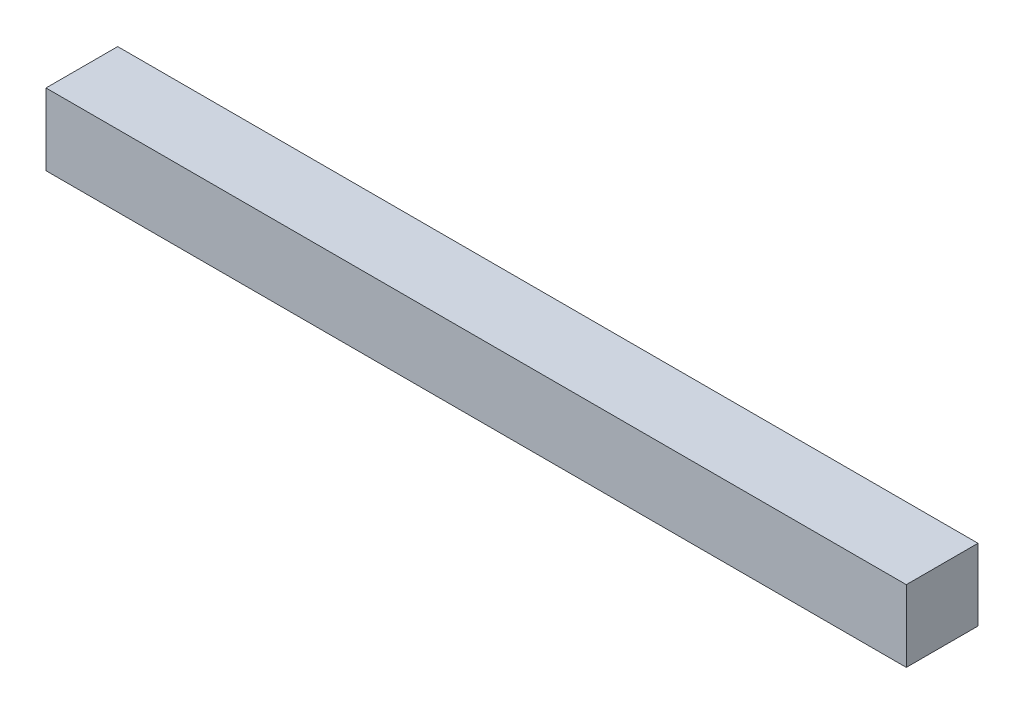
ISO-10303-21;
HEADER;
FILE_DESCRIPTION(('STEP AP214'),'2;1');
FILE_NAME('part.step','',(''),(''),'','','');
FILE_SCHEMA(('AUTOMOTIVE_DESIGN { 1 0 10303 214 1 1 1 1 }'));
ENDSEC;
DATA;
#1=APPLICATION_CONTEXT('core data for automotive mechanical design processes');
#2=APPLICATION_PROTOCOL_DEFINITION('international standard','automotive_design',2000,#1);
#3=PRODUCT_CONTEXT('',#1,'mechanical');
#4=PRODUCT('Part','Part','',(#3));
#5=PRODUCT_RELATED_PRODUCT_CATEGORY('part','',(#4));
#6=PRODUCT_DEFINITION_FORMATION('','',#4);
#7=PRODUCT_DEFINITION_CONTEXT('part definition',#1,'design');
#8=PRODUCT_DEFINITION('design','',#6,#7);
#9=PRODUCT_DEFINITION_SHAPE('','',#8);
#10=(LENGTH_UNIT() NAMED_UNIT(*) SI_UNIT(.MILLI.,.METRE.));
#11=(NAMED_UNIT(*) PLANE_ANGLE_UNIT() SI_UNIT($,.RADIAN.));
#12=(NAMED_UNIT(*) SI_UNIT($,.STERADIAN.) SOLID_ANGLE_UNIT());
#13=UNCERTAINTY_MEASURE_WITH_UNIT(LENGTH_MEASURE(1.E-05),#10,'distance_accuracy_value','');
#14=(GEOMETRIC_REPRESENTATION_CONTEXT(3) GLOBAL_UNCERTAINTY_ASSIGNED_CONTEXT((#13)) GLOBAL_UNIT_ASSIGNED_CONTEXT((#10,
#11,#12)) REPRESENTATION_CONTEXT('',''));
#15=CARTESIAN_POINT('',(0.,0.,0.));
#16=DIRECTION('',(0.,0.,1.));
#17=DIRECTION('',(1.,0.,0.));
#18=AXIS2_PLACEMENT_3D('',#15,#16,#17);
#19=CARTESIAN_POINT('',(0.,19.05,0.));
#20=DIRECTION('',(1.,0.,0.));
#21=DIRECTION('',(0.,0.,-1.));
#22=AXIS2_PLACEMENT_3D('',#19,#20,#21);
#23=PLANE('',#22);
#24=DIRECTION('',(0.,0.,1.));
#25=VECTOR('',#24,1.);
#26=CARTESIAN_POINT('',(0.,0.,0.));
#27=LINE('',#26,#25);
#28=CARTESIAN_POINT('',(0.,0.,-19.05));
#29=VERTEX_POINT('',#28);
#30=CARTESIAN_POINT('',(0.,0.,0.));
#31=VERTEX_POINT('',#30);
#32=EDGE_CURVE('E98',#29,#31,#27,.T.);
#33=ORIENTED_EDGE('',*,*,#32,.T.);
#34=DIRECTION('',(0.,-1.,0.));
#35=VECTOR('',#34,1.);
#36=CARTESIAN_POINT('',(0.,19.05,0.));
#37=LINE('',#36,#35);
#38=CARTESIAN_POINT('',(0.,19.05,0.));
#39=VERTEX_POINT('',#38);
#40=EDGE_CURVE('E11',#39,#31,#37,.T.);
#41=ORIENTED_EDGE('',*,*,#40,.F.);
#42=DIRECTION('',(0.,0.,1.));
#43=VECTOR('',#42,1.);
#44=CARTESIAN_POINT('',(0.,19.05,0.));
#45=LINE('',#44,#43);
#46=CARTESIAN_POINT('',(0.,19.05,-19.05));
#47=VERTEX_POINT('',#46);
#48=EDGE_CURVE('E86',#47,#39,#45,.T.);
#49=ORIENTED_EDGE('',*,*,#48,.F.);
#50=DIRECTION('',(0.,-1.,0.));
#51=VECTOR('',#50,1.);
#52=CARTESIAN_POINT('',(0.,19.05,-19.05));
#53=LINE('',#52,#51);
#54=EDGE_CURVE('E94',#47,#29,#53,.T.);
#55=ORIENTED_EDGE('',*,*,#54,.T.);
#56=EDGE_LOOP('',(#33,#41,#49,#55));
#57=FACE_BOUND('',#56,.T.);
#58=ADVANCED_FACE('F35',(#57),#23,.F.);
#59=CARTESIAN_POINT('',(0.,19.05,0.));
#60=DIRECTION('',(0.,0.,-1.));
#61=DIRECTION('',(-1.,0.,0.));
#62=AXIS2_PLACEMENT_3D('',#59,#60,#61);
#63=PLANE('',#62);
#64=DIRECTION('',(1.,0.,0.));
#65=VECTOR('',#64,1.);
#66=CARTESIAN_POINT('',(0.,0.,0.));
#67=LINE('',#66,#65);
#68=CARTESIAN_POINT('',(228.6,0.,0.));
#69=VERTEX_POINT('',#68);
#70=EDGE_CURVE('E90',#31,#69,#67,.T.);
#71=ORIENTED_EDGE('',*,*,#70,.T.);
#72=DIRECTION('',(0.,-1.,0.));
#73=VECTOR('',#72,1.);
#74=CARTESIAN_POINT('',(228.6,19.05,0.));
#75=LINE('',#74,#73);
#76=CARTESIAN_POINT('',(228.6,19.05,0.));
#77=VERTEX_POINT('',#76);
#78=EDGE_CURVE('E43',#77,#69,#75,.T.);
#79=ORIENTED_EDGE('',*,*,#78,.F.);
#80=DIRECTION('',(1.,0.,0.));
#81=VECTOR('',#80,1.);
#82=CARTESIAN_POINT('',(0.,19.05,0.));
#83=LINE('',#82,#81);
#84=EDGE_CURVE('E81',#39,#77,#83,.T.);
#85=ORIENTED_EDGE('',*,*,#84,.F.);
#86=ORIENTED_EDGE('',*,*,#40,.T.);
#87=EDGE_LOOP('',(#71,#79,#85,#86));
#88=FACE_BOUND('',#87,.T.);
#89=ADVANCED_FACE('F89',(#88),#63,.F.);
#90=CARTESIAN_POINT('',(228.6,19.05,0.));
#91=DIRECTION('',(-1.,0.,0.));
#92=DIRECTION('',(0.,0.,1.));
#93=AXIS2_PLACEMENT_3D('',#90,#91,#92);
#94=PLANE('',#93);
#95=DIRECTION('',(0.,0.,-1.));
#96=VECTOR('',#95,1.);
#97=CARTESIAN_POINT('',(228.6,0.,0.));
#98=LINE('',#97,#96);
#99=CARTESIAN_POINT('',(228.6,0.,-19.05));
#100=VERTEX_POINT('',#99);
#101=EDGE_CURVE('E68',#69,#100,#98,.T.);
#102=ORIENTED_EDGE('',*,*,#101,.T.);
#103=DIRECTION('',(0.,-1.,0.));
#104=VECTOR('',#103,1.);
#105=CARTESIAN_POINT('',(228.6,19.05,-19.05));
#106=LINE('',#105,#104);
#107=CARTESIAN_POINT('',(228.6,19.05,-19.05));
#108=VERTEX_POINT('',#107);
#109=EDGE_CURVE('E91',#108,#100,#106,.T.);
#110=ORIENTED_EDGE('',*,*,#109,.F.);
#111=DIRECTION('',(0.,0.,-1.));
#112=VECTOR('',#111,1.);
#113=CARTESIAN_POINT('',(228.6,19.05,0.));
#114=LINE('',#113,#112);
#115=EDGE_CURVE('E84',#77,#108,#114,.T.);
#116=ORIENTED_EDGE('',*,*,#115,.F.);
#117=ORIENTED_EDGE('',*,*,#78,.T.);
#118=EDGE_LOOP('',(#102,#110,#116,#117));
#119=FACE_BOUND('',#118,.T.);
#120=ADVANCED_FACE('F92',(#119),#94,.F.);
#121=CARTESIAN_POINT('',(0.,19.05,-19.05));
#122=DIRECTION('',(0.,0.,1.));
#123=DIRECTION('',(1.,0.,0.));
#124=AXIS2_PLACEMENT_3D('',#121,#122,#123);
#125=PLANE('',#124);
#126=DIRECTION('',(-1.,0.,0.));
#127=VECTOR('',#126,1.);
#128=CARTESIAN_POINT('',(0.,0.,-19.05));
#129=LINE('',#128,#127);
#130=EDGE_CURVE('E74',#100,#29,#129,.T.);
#131=ORIENTED_EDGE('',*,*,#130,.T.);
#132=ORIENTED_EDGE('',*,*,#54,.F.);
#133=DIRECTION('',(-1.,0.,0.));
#134=VECTOR('',#133,1.);
#135=CARTESIAN_POINT('',(0.,19.05,-19.05));
#136=LINE('',#135,#134);
#137=EDGE_CURVE('E51',#108,#47,#136,.T.);
#138=ORIENTED_EDGE('',*,*,#137,.F.);
#139=ORIENTED_EDGE('',*,*,#109,.T.);
#140=EDGE_LOOP('',(#131,#132,#138,#139));
#141=FACE_BOUND('',#140,.T.);
#142=ADVANCED_FACE('F105',(#141),#125,.F.);
#143=CARTESIAN_POINT('',(0.,19.05,0.));
#144=DIRECTION('',(0.,-1.,0.));
#145=DIRECTION('',(0.,0.,-1.));
#146=AXIS2_PLACEMENT_3D('',#143,#144,#145);
#147=PLANE('',#146);
#148=ORIENTED_EDGE('',*,*,#48,.T.);
#149=ORIENTED_EDGE('',*,*,#84,.T.);
#150=ORIENTED_EDGE('',*,*,#115,.T.);
#151=ORIENTED_EDGE('',*,*,#137,.T.);
#152=EDGE_LOOP('',(#148,#149,#150,#151));
#153=FACE_BOUND('',#152,.T.);
#154=ADVANCED_FACE('F82',(#153),#147,.F.);
#155=CARTESIAN_POINT('',(0.,0.,0.));
#156=DIRECTION('',(0.,-1.,0.));
#157=DIRECTION('',(0.,0.,-1.));
#158=AXIS2_PLACEMENT_3D('',#155,#156,#157);
#159=PLANE('',#158);
#160=ORIENTED_EDGE('',*,*,#32,.F.);
#161=ORIENTED_EDGE('',*,*,#130,.F.);
#162=ORIENTED_EDGE('',*,*,#101,.F.);
#163=ORIENTED_EDGE('',*,*,#70,.F.);
#164=EDGE_LOOP('',(#160,#161,#162,#163));
#165=FACE_BOUND('',#164,.T.);
#166=ADVANCED_FACE('F108',(#165),#159,.T.);
#167=CLOSED_SHELL('',(#58,#89,#120,#142,#154,#166));
#168=MANIFOLD_SOLID_BREP('B2',#167);
#169=ADVANCED_BREP_SHAPE_REPRESENTATION('',(#18,#168),#14);
#170=SHAPE_DEFINITION_REPRESENTATION(#9,#169);
ENDSEC;
END-ISO-10303-21;
